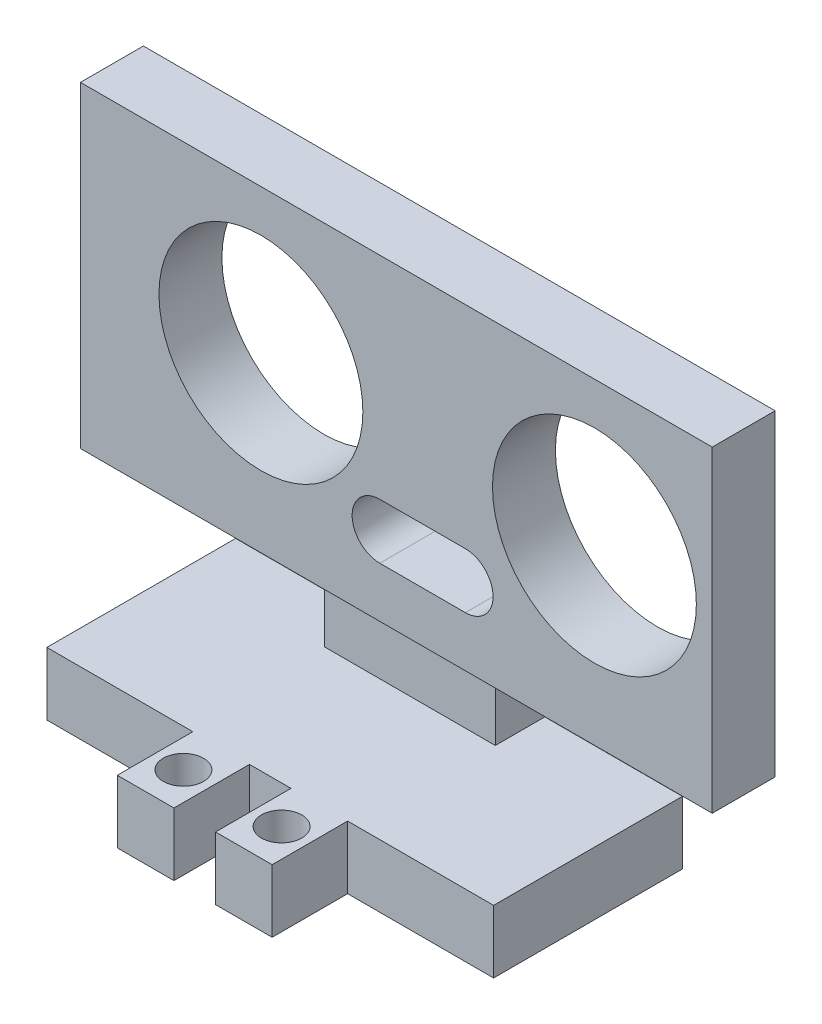
ISO-10303-21;
HEADER;
FILE_DESCRIPTION(('STEP AP214'),'2;1');
FILE_NAME('part.step','',(''),(''),'','','');
FILE_SCHEMA(('AUTOMOTIVE_DESIGN { 1 0 10303 214 1 1 1 1 }'));
ENDSEC;
DATA;
#1=APPLICATION_CONTEXT('core data for automotive mechanical design processes');
#2=APPLICATION_PROTOCOL_DEFINITION('international standard','automotive_design',2000,#1);
#3=PRODUCT_CONTEXT('',#1,'mechanical');
#4=PRODUCT('Part','Part','',(#3));
#5=PRODUCT_RELATED_PRODUCT_CATEGORY('part','',(#4));
#6=PRODUCT_DEFINITION_FORMATION('','',#4);
#7=PRODUCT_DEFINITION_CONTEXT('part definition',#1,'design');
#8=PRODUCT_DEFINITION('design','',#6,#7);
#9=PRODUCT_DEFINITION_SHAPE('','',#8);
#10=(LENGTH_UNIT() NAMED_UNIT(*) SI_UNIT(.MILLI.,.METRE.));
#11=(NAMED_UNIT(*) PLANE_ANGLE_UNIT() SI_UNIT($,.RADIAN.));
#12=(NAMED_UNIT(*) SI_UNIT($,.STERADIAN.) SOLID_ANGLE_UNIT());
#13=UNCERTAINTY_MEASURE_WITH_UNIT(LENGTH_MEASURE(1.E-05),#10,'distance_accuracy_value','');
#14=(GEOMETRIC_REPRESENTATION_CONTEXT(3) GLOBAL_UNCERTAINTY_ASSIGNED_CONTEXT((#13)) GLOBAL_UNIT_ASSIGNED_CONTEXT((#10,
#11,#12)) REPRESENTATION_CONTEXT('',''));
#15=CARTESIAN_POINT('',(0.,0.,0.));
#16=DIRECTION('',(0.,0.,1.));
#17=DIRECTION('',(1.,0.,0.));
#18=AXIS2_PLACEMENT_3D('',#15,#16,#17);
#19=CARTESIAN_POINT('',(0.,5.,-21.2753882568971));
#20=DIRECTION('',(0.,0.,-1.));
#21=DIRECTION('',(-1.,0.,0.));
#22=AXIS2_PLACEMENT_3D('',#19,#20,#21);
#23=PLANE('',#22);
#24=DIRECTION('',(1.,0.,0.));
#25=VECTOR('',#24,1.);
#26=CARTESIAN_POINT('',(0.,0.,-21.2753882568971));
#27=LINE('',#26,#25);
#28=CARTESIAN_POINT('',(12.7692142640546,0.,-21.2753882568971));
#29=VERTEX_POINT('',#28);
#30=CARTESIAN_POINT('',(48.2692142640546,0.,-21.2753882568971));
#31=VERTEX_POINT('',#30);
#32=EDGE_CURVE('E304',#29,#31,#27,.T.);
#33=ORIENTED_EDGE('',*,*,#32,.F.);
#34=DIRECTION('',(0.,-1.,0.));
#35=VECTOR('',#34,1.);
#36=CARTESIAN_POINT('',(12.7692142640546,5.,-21.2753882568971));
#37=LINE('',#36,#35);
#38=CARTESIAN_POINT('',(12.7692142640546,5.,-21.2753882568971));
#39=VERTEX_POINT('',#38);
#40=EDGE_CURVE('E391',#39,#29,#37,.T.);
#41=ORIENTED_EDGE('',*,*,#40,.F.);
#42=DIRECTION('',(1.,0.,0.));
#43=VECTOR('',#42,1.);
#44=CARTESIAN_POINT('',(0.,5.,-21.2753882568971));
#45=LINE('',#44,#43);
#46=CARTESIAN_POINT('',(23.7692142640546,5.,-21.2753882568971));
#47=VERTEX_POINT('',#46);
#48=EDGE_CURVE('E305',#39,#47,#45,.T.);
#49=ORIENTED_EDGE('',*,*,#48,.T.);
#50=DIRECTION('',(0.,-1.,0.));
#51=VECTOR('',#50,1.);
#52=CARTESIAN_POINT('',(23.7692142640546,10.,-21.2753882568971));
#53=LINE('',#52,#51);
#54=CARTESIAN_POINT('',(23.7692142640546,10.,-21.2753882568971));
#55=VERTEX_POINT('',#54);
#56=EDGE_CURVE('E285',#55,#47,#53,.T.);
#57=ORIENTED_EDGE('',*,*,#56,.F.);
#58=DIRECTION('',(-1.,0.,0.));
#59=VECTOR('',#58,1.);
#60=CARTESIAN_POINT('',(23.7692142640546,10.,-21.2753882568971));
#61=LINE('',#60,#59);
#62=CARTESIAN_POINT('',(37.3362993394962,10.,-21.2753882568971));
#63=VERTEX_POINT('',#62);
#64=EDGE_CURVE('E282',#63,#55,#61,.T.);
#65=ORIENTED_EDGE('',*,*,#64,.F.);
#66=DIRECTION('',(0.,-1.,0.));
#67=VECTOR('',#66,1.);
#68=CARTESIAN_POINT('',(37.3362993394962,10.,-21.2753882568971));
#69=LINE('',#68,#67);
#70=CARTESIAN_POINT('',(37.3362993394962,5.,-21.2753882568971));
#71=VERTEX_POINT('',#70);
#72=EDGE_CURVE('E295',#63,#71,#69,.T.);
#73=ORIENTED_EDGE('',*,*,#72,.T.);
#74=CARTESIAN_POINT('',(48.2692142640546,5.,-21.2753882568971));
#75=VERTEX_POINT('',#74);
#76=EDGE_CURVE('E309',#71,#75,#45,.T.);
#77=ORIENTED_EDGE('',*,*,#76,.T.);
#78=DIRECTION('',(0.,-1.,0.));
#79=VECTOR('',#78,1.);
#80=CARTESIAN_POINT('',(48.2692142640546,5.,-21.2753882568971));
#81=LINE('',#80,#79);
#82=EDGE_CURVE('E334',#75,#31,#81,.T.);
#83=ORIENTED_EDGE('',*,*,#82,.T.);
#84=EDGE_LOOP('',(#33,#41,#49,#57,#65,#73,#77,#83));
#85=FACE_BOUND('',#84,.T.);
#86=ADVANCED_FACE('F44',(#85),#23,.T.);
#87=CARTESIAN_POINT('',(12.7692142640546,5.,0.));
#88=DIRECTION('',(1.,0.,0.));
#89=DIRECTION('',(0.,0.,-1.));
#90=AXIS2_PLACEMENT_3D('',#87,#88,#89);
#91=PLANE('',#90);
#92=DIRECTION('',(0.,0.,1.));
#93=VECTOR('',#92,1.);
#94=CARTESIAN_POINT('',(12.7692142640546,0.,0.));
#95=LINE('',#94,#93);
#96=CARTESIAN_POINT('',(12.7692142640546,0.,-6.27538825689709));
#97=VERTEX_POINT('',#96);
#98=EDGE_CURVE('E337',#29,#97,#95,.T.);
#99=ORIENTED_EDGE('',*,*,#98,.T.);
#100=DIRECTION('',(0.,-1.,0.));
#101=VECTOR('',#100,1.);
#102=CARTESIAN_POINT('',(12.7692142640546,5.,-6.27538825689709));
#103=LINE('',#102,#101);
#104=CARTESIAN_POINT('',(12.7692142640546,5.,-6.27538825689709));
#105=VERTEX_POINT('',#104);
#106=EDGE_CURVE('E388',#105,#97,#103,.T.);
#107=ORIENTED_EDGE('',*,*,#106,.F.);
#108=DIRECTION('',(0.,0.,1.));
#109=VECTOR('',#108,1.);
#110=CARTESIAN_POINT('',(12.7692142640546,5.,0.));
#111=LINE('',#110,#109);
#112=EDGE_CURVE('E308',#39,#105,#111,.T.);
#113=ORIENTED_EDGE('',*,*,#112,.F.);
#114=ORIENTED_EDGE('',*,*,#40,.T.);
#115=EDGE_LOOP('',(#99,#107,#113,#114));
#116=FACE_BOUND('',#115,.T.);
#117=ADVANCED_FACE('F453',(#116),#91,.F.);
#118=CARTESIAN_POINT('',(0.,5.,-6.27538825689709));
#119=DIRECTION('',(0.,0.,-1.));
#120=DIRECTION('',(-1.,0.,0.));
#121=AXIS2_PLACEMENT_3D('',#118,#119,#120);
#122=PLANE('',#121);
#123=DIRECTION('',(1.,0.,0.));
#124=VECTOR('',#123,1.);
#125=CARTESIAN_POINT('',(0.,0.,-6.27538825689709));
#126=LINE('',#125,#124);
#127=CARTESIAN_POINT('',(24.3692142640547,0.,-6.27538825689709));
#128=VERTEX_POINT('',#127);
#129=EDGE_CURVE('E339',#97,#128,#126,.T.);
#130=ORIENTED_EDGE('',*,*,#129,.T.);
#131=DIRECTION('',(0.,-1.,0.));
#132=VECTOR('',#131,1.);
#133=CARTESIAN_POINT('',(24.3692142640547,5.,-6.27538825689709));
#134=LINE('',#133,#132);
#135=CARTESIAN_POINT('',(24.3692142640547,5.,-6.27538825689709));
#136=VERTEX_POINT('',#135);
#137=EDGE_CURVE('E386',#136,#128,#134,.T.);
#138=ORIENTED_EDGE('',*,*,#137,.F.);
#139=DIRECTION('',(1.,0.,0.));
#140=VECTOR('',#139,1.);
#141=CARTESIAN_POINT('',(0.,5.,-6.27538825689709));
#142=LINE('',#141,#140);
#143=EDGE_CURVE('E311',#105,#136,#142,.T.);
#144=ORIENTED_EDGE('',*,*,#143,.F.);
#145=ORIENTED_EDGE('',*,*,#106,.T.);
#146=EDGE_LOOP('',(#130,#138,#144,#145));
#147=FACE_BOUND('',#146,.T.);
#148=ADVANCED_FACE('F458',(#147),#122,.F.);
#149=CARTESIAN_POINT('',(24.3692142640547,5.,0.));
#150=DIRECTION('',(-1.,0.,0.));
#151=DIRECTION('',(0.,0.,1.));
#152=AXIS2_PLACEMENT_3D('',#149,#150,#151);
#153=PLANE('',#152);
#154=DIRECTION('',(0.,0.,-1.));
#155=VECTOR('',#154,1.);
#156=CARTESIAN_POINT('',(24.3692142640547,0.,0.));
#157=LINE('',#156,#155);
#158=CARTESIAN_POINT('',(24.3692142640547,0.,-0.275388256897094));
#159=VERTEX_POINT('',#158);
#160=EDGE_CURVE('E342',#159,#128,#157,.T.);
#161=ORIENTED_EDGE('',*,*,#160,.F.);
#162=DIRECTION('',(0.,-1.,0.));
#163=VECTOR('',#162,1.);
#164=CARTESIAN_POINT('',(24.3692142640547,5.,-0.275388256897094));
#165=LINE('',#164,#163);
#166=CARTESIAN_POINT('',(24.3692142640547,5.,-0.275388256897094));
#167=VERTEX_POINT('',#166);
#168=EDGE_CURVE('E384',#167,#159,#165,.T.);
#169=ORIENTED_EDGE('',*,*,#168,.F.);
#170=DIRECTION('',(0.,0.,-1.));
#171=VECTOR('',#170,1.);
#172=CARTESIAN_POINT('',(24.3692142640547,5.,0.));
#173=LINE('',#172,#171);
#174=EDGE_CURVE('E313',#167,#136,#173,.T.);
#175=ORIENTED_EDGE('',*,*,#174,.T.);
#176=ORIENTED_EDGE('',*,*,#137,.T.);
#177=EDGE_LOOP('',(#161,#169,#175,#176));
#178=FACE_BOUND('',#177,.T.);
#179=ADVANCED_FACE('F463',(#178),#153,.T.);
#180=CARTESIAN_POINT('',(0.,5.,-0.275388256897092));
#181=DIRECTION('',(0.,0.,-1.));
#182=DIRECTION('',(-1.,0.,0.));
#183=AXIS2_PLACEMENT_3D('',#180,#181,#182);
#184=PLANE('',#183);
#185=DIRECTION('',(1.,0.,0.));
#186=VECTOR('',#185,1.);
#187=CARTESIAN_POINT('',(0.,0.,-0.275388256897092));
#188=LINE('',#187,#186);
#189=CARTESIAN_POINT('',(28.8692142640547,0.,-0.275388256897094));
#190=VERTEX_POINT('',#189);
#191=EDGE_CURVE('E345',#159,#190,#188,.T.);
#192=ORIENTED_EDGE('',*,*,#191,.T.);
#193=DIRECTION('',(0.,-1.,0.));
#194=VECTOR('',#193,1.);
#195=CARTESIAN_POINT('',(28.8692142640547,5.,-0.275388256897094));
#196=LINE('',#195,#194);
#197=CARTESIAN_POINT('',(28.8692142640547,5.,-0.275388256897094));
#198=VERTEX_POINT('',#197);
#199=EDGE_CURVE('E381',#198,#190,#196,.T.);
#200=ORIENTED_EDGE('',*,*,#199,.F.);
#201=DIRECTION('',(1.,0.,0.));
#202=VECTOR('',#201,1.);
#203=CARTESIAN_POINT('',(0.,5.,-0.275388256897092));
#204=LINE('',#203,#202);
#205=EDGE_CURVE('E316',#167,#198,#204,.T.);
#206=ORIENTED_EDGE('',*,*,#205,.F.);
#207=ORIENTED_EDGE('',*,*,#168,.T.);
#208=EDGE_LOOP('',(#192,#200,#206,#207));
#209=FACE_BOUND('',#208,.T.);
#210=ADVANCED_FACE('F469',(#209),#184,.F.);
#211=CARTESIAN_POINT('',(28.8692142640547,5.,0.));
#212=DIRECTION('',(-1.,0.,0.));
#213=DIRECTION('',(0.,0.,1.));
#214=AXIS2_PLACEMENT_3D('',#211,#212,#213);
#215=PLANE('',#214);
#216=DIRECTION('',(0.,0.,-1.));
#217=VECTOR('',#216,1.);
#218=CARTESIAN_POINT('',(28.8692142640547,0.,0.));
#219=LINE('',#218,#217);
#220=CARTESIAN_POINT('',(28.8692142640547,0.,-6.27538825689709));
#221=VERTEX_POINT('',#220);
#222=EDGE_CURVE('E347',#190,#221,#219,.T.);
#223=ORIENTED_EDGE('',*,*,#222,.T.);
#224=DIRECTION('',(0.,-1.,0.));
#225=VECTOR('',#224,1.);
#226=CARTESIAN_POINT('',(28.8692142640547,5.,-6.27538825689709));
#227=LINE('',#226,#225);
#228=CARTESIAN_POINT('',(28.8692142640547,5.,-6.27538825689709));
#229=VERTEX_POINT('',#228);
#230=EDGE_CURVE('E378',#229,#221,#227,.T.);
#231=ORIENTED_EDGE('',*,*,#230,.F.);
#232=DIRECTION('',(0.,0.,-1.));
#233=VECTOR('',#232,1.);
#234=CARTESIAN_POINT('',(28.8692142640547,5.,0.));
#235=LINE('',#234,#233);
#236=EDGE_CURVE('E318',#198,#229,#235,.T.);
#237=ORIENTED_EDGE('',*,*,#236,.F.);
#238=ORIENTED_EDGE('',*,*,#199,.T.);
#239=EDGE_LOOP('',(#223,#231,#237,#238));
#240=FACE_BOUND('',#239,.T.);
#241=ADVANCED_FACE('F473',(#240),#215,.F.);
#242=CARTESIAN_POINT('',(0.,5.,-6.27538825689709));
#243=DIRECTION('',(0.,0.,-1.));
#244=DIRECTION('',(-1.,0.,0.));
#245=AXIS2_PLACEMENT_3D('',#242,#243,#244);
#246=PLANE('',#245);
#247=DIRECTION('',(1.,0.,0.));
#248=VECTOR('',#247,1.);
#249=CARTESIAN_POINT('',(0.,0.,-6.27538825689709));
#250=LINE('',#249,#248);
#251=CARTESIAN_POINT('',(32.1692142640546,0.,-6.27538825689709));
#252=VERTEX_POINT('',#251);
#253=EDGE_CURVE('E349',#221,#252,#250,.T.);
#254=ORIENTED_EDGE('',*,*,#253,.T.);
#255=DIRECTION('',(0.,-1.,0.));
#256=VECTOR('',#255,1.);
#257=CARTESIAN_POINT('',(32.1692142640546,5.,-6.27538825689709));
#258=LINE('',#257,#256);
#259=CARTESIAN_POINT('',(32.1692142640546,5.,-6.27538825689709));
#260=VERTEX_POINT('',#259);
#261=EDGE_CURVE('E376',#260,#252,#258,.T.);
#262=ORIENTED_EDGE('',*,*,#261,.F.);
#263=DIRECTION('',(1.,0.,0.));
#264=VECTOR('',#263,1.);
#265=CARTESIAN_POINT('',(0.,5.,-6.27538825689709));
#266=LINE('',#265,#264);
#267=EDGE_CURVE('E320',#229,#260,#266,.T.);
#268=ORIENTED_EDGE('',*,*,#267,.F.);
#269=ORIENTED_EDGE('',*,*,#230,.T.);
#270=EDGE_LOOP('',(#254,#262,#268,#269));
#271=FACE_BOUND('',#270,.T.);
#272=ADVANCED_FACE('F477',(#271),#246,.F.);
#273=CARTESIAN_POINT('',(32.1692142640546,5.,0.));
#274=DIRECTION('',(-1.,0.,0.));
#275=DIRECTION('',(0.,0.,1.));
#276=AXIS2_PLACEMENT_3D('',#273,#274,#275);
#277=PLANE('',#276);
#278=DIRECTION('',(0.,0.,-1.));
#279=VECTOR('',#278,1.);
#280=CARTESIAN_POINT('',(32.1692142640546,0.,0.));
#281=LINE('',#280,#279);
#282=CARTESIAN_POINT('',(32.1692142640546,0.,-0.275388256897094));
#283=VERTEX_POINT('',#282);
#284=EDGE_CURVE('E352',#283,#252,#281,.T.);
#285=ORIENTED_EDGE('',*,*,#284,.F.);
#286=DIRECTION('',(0.,-1.,0.));
#287=VECTOR('',#286,1.);
#288=CARTESIAN_POINT('',(32.1692142640546,5.,-0.275388256897094));
#289=LINE('',#288,#287);
#290=CARTESIAN_POINT('',(32.1692142640546,5.,-0.275388256897094));
#291=VERTEX_POINT('',#290);
#292=EDGE_CURVE('E374',#291,#283,#289,.T.);
#293=ORIENTED_EDGE('',*,*,#292,.F.);
#294=DIRECTION('',(0.,0.,-1.));
#295=VECTOR('',#294,1.);
#296=CARTESIAN_POINT('',(32.1692142640546,5.,0.));
#297=LINE('',#296,#295);
#298=EDGE_CURVE('E322',#291,#260,#297,.T.);
#299=ORIENTED_EDGE('',*,*,#298,.T.);
#300=ORIENTED_EDGE('',*,*,#261,.T.);
#301=EDGE_LOOP('',(#285,#293,#299,#300));
#302=FACE_BOUND('',#301,.T.);
#303=ADVANCED_FACE('F481',(#302),#277,.T.);
#304=CARTESIAN_POINT('',(0.,5.,-0.275388256897095));
#305=DIRECTION('',(0.,0.,-1.));
#306=DIRECTION('',(-1.,0.,0.));
#307=AXIS2_PLACEMENT_3D('',#304,#305,#306);
#308=PLANE('',#307);
#309=DIRECTION('',(1.,0.,0.));
#310=VECTOR('',#309,1.);
#311=CARTESIAN_POINT('',(0.,0.,-0.275388256897095));
#312=LINE('',#311,#310);
#313=CARTESIAN_POINT('',(36.6692142640546,0.,-0.275388256897094));
#314=VERTEX_POINT('',#313);
#315=EDGE_CURVE('E355',#283,#314,#312,.T.);
#316=ORIENTED_EDGE('',*,*,#315,.T.);
#317=DIRECTION('',(0.,-1.,0.));
#318=VECTOR('',#317,1.);
#319=CARTESIAN_POINT('',(36.6692142640546,5.,-0.275388256897094));
#320=LINE('',#319,#318);
#321=CARTESIAN_POINT('',(36.6692142640546,5.,-0.275388256897094));
#322=VERTEX_POINT('',#321);
#323=EDGE_CURVE('E371',#322,#314,#320,.T.);
#324=ORIENTED_EDGE('',*,*,#323,.F.);
#325=DIRECTION('',(1.,0.,0.));
#326=VECTOR('',#325,1.);
#327=CARTESIAN_POINT('',(0.,5.,-0.275388256897095));
#328=LINE('',#327,#326);
#329=EDGE_CURVE('E325',#291,#322,#328,.T.);
#330=ORIENTED_EDGE('',*,*,#329,.F.);
#331=ORIENTED_EDGE('',*,*,#292,.T.);
#332=EDGE_LOOP('',(#316,#324,#330,#331));
#333=FACE_BOUND('',#332,.T.);
#334=ADVANCED_FACE('F485',(#333),#308,.F.);
#335=CARTESIAN_POINT('',(36.6692142640546,5.,0.));
#336=DIRECTION('',(-1.,0.,0.));
#337=DIRECTION('',(0.,0.,1.));
#338=AXIS2_PLACEMENT_3D('',#335,#336,#337);
#339=PLANE('',#338);
#340=DIRECTION('',(0.,0.,-1.));
#341=VECTOR('',#340,1.);
#342=CARTESIAN_POINT('',(36.6692142640546,0.,0.));
#343=LINE('',#342,#341);
#344=CARTESIAN_POINT('',(36.6692142640546,0.,-6.27538825689709));
#345=VERTEX_POINT('',#344);
#346=EDGE_CURVE('E357',#314,#345,#343,.T.);
#347=ORIENTED_EDGE('',*,*,#346,.T.);
#348=DIRECTION('',(0.,-1.,0.));
#349=VECTOR('',#348,1.);
#350=CARTESIAN_POINT('',(36.6692142640546,5.,-6.27538825689709));
#351=LINE('',#350,#349);
#352=CARTESIAN_POINT('',(36.6692142640546,5.,-6.27538825689709));
#353=VERTEX_POINT('',#352);
#354=EDGE_CURVE('E368',#353,#345,#351,.T.);
#355=ORIENTED_EDGE('',*,*,#354,.F.);
#356=DIRECTION('',(0.,0.,-1.));
#357=VECTOR('',#356,1.);
#358=CARTESIAN_POINT('',(36.6692142640546,5.,0.));
#359=LINE('',#358,#357);
#360=EDGE_CURVE('E327',#322,#353,#359,.T.);
#361=ORIENTED_EDGE('',*,*,#360,.F.);
#362=ORIENTED_EDGE('',*,*,#323,.T.);
#363=EDGE_LOOP('',(#347,#355,#361,#362));
#364=FACE_BOUND('',#363,.T.);
#365=ADVANCED_FACE('F489',(#364),#339,.F.);
#366=CARTESIAN_POINT('',(0.,5.,-6.27538825689709));
#367=DIRECTION('',(0.,0.,-1.));
#368=DIRECTION('',(-1.,0.,0.));
#369=AXIS2_PLACEMENT_3D('',#366,#367,#368);
#370=PLANE('',#369);
#371=DIRECTION('',(1.,0.,0.));
#372=VECTOR('',#371,1.);
#373=CARTESIAN_POINT('',(0.,0.,-6.27538825689709));
#374=LINE('',#373,#372);
#375=CARTESIAN_POINT('',(48.2692142640546,0.,-6.27538825689709));
#376=VERTEX_POINT('',#375);
#377=EDGE_CURVE('E359',#345,#376,#374,.T.);
#378=ORIENTED_EDGE('',*,*,#377,.T.);
#379=DIRECTION('',(0.,-1.,0.));
#380=VECTOR('',#379,1.);
#381=CARTESIAN_POINT('',(48.2692142640546,5.,-6.27538825689709));
#382=LINE('',#381,#380);
#383=CARTESIAN_POINT('',(48.2692142640546,5.,-6.27538825689709));
#384=VERTEX_POINT('',#383);
#385=EDGE_CURVE('E366',#384,#376,#382,.T.);
#386=ORIENTED_EDGE('',*,*,#385,.F.);
#387=DIRECTION('',(1.,0.,0.));
#388=VECTOR('',#387,1.);
#389=CARTESIAN_POINT('',(0.,5.,-6.27538825689709));
#390=LINE('',#389,#388);
#391=EDGE_CURVE('E329',#353,#384,#390,.T.);
#392=ORIENTED_EDGE('',*,*,#391,.F.);
#393=ORIENTED_EDGE('',*,*,#354,.T.);
#394=EDGE_LOOP('',(#378,#386,#392,#393));
#395=FACE_BOUND('',#394,.T.);
#396=ADVANCED_FACE('F493',(#395),#370,.F.);
#397=CARTESIAN_POINT('',(48.2692142640546,5.,0.));
#398=DIRECTION('',(1.,0.,0.));
#399=DIRECTION('',(0.,0.,-1.));
#400=AXIS2_PLACEMENT_3D('',#397,#398,#399);
#401=PLANE('',#400);
#402=DIRECTION('',(0.,0.,1.));
#403=VECTOR('',#402,1.);
#404=CARTESIAN_POINT('',(48.2692142640546,0.,0.));
#405=LINE('',#404,#403);
#406=EDGE_CURVE('E362',#31,#376,#405,.T.);
#407=ORIENTED_EDGE('',*,*,#406,.F.);
#408=ORIENTED_EDGE('',*,*,#82,.F.);
#409=DIRECTION('',(0.,0.,1.));
#410=VECTOR('',#409,1.);
#411=CARTESIAN_POINT('',(48.2692142640546,5.,0.));
#412=LINE('',#411,#410);
#413=EDGE_CURVE('E331',#75,#384,#412,.T.);
#414=ORIENTED_EDGE('',*,*,#413,.T.);
#415=ORIENTED_EDGE('',*,*,#385,.T.);
#416=EDGE_LOOP('',(#407,#408,#414,#415));
#417=FACE_BOUND('',#416,.T.);
#418=ADVANCED_FACE('F422',(#417),#401,.T.);
#419=CARTESIAN_POINT('',(0.,5.,0.));
#420=DIRECTION('',(0.,1.,0.));
#421=DIRECTION('',(0.,0.,1.));
#422=AXIS2_PLACEMENT_3D('',#419,#420,#421);
#423=PLANE('',#422);
#424=CARTESIAN_POINT('',(26.6192142640546,5.,-3.27538825689709));
#425=DIRECTION('',(0.,1.,0.));
#426=DIRECTION('',(0.,0.,1.));
#427=AXIS2_PLACEMENT_3D('',#424,#425,#426);
#428=CIRCLE('',#427,1.6);
#429=CARTESIAN_POINT('',(26.6192142640546,5.,-1.67538825689709));
#430=VERTEX_POINT('',#429);
#431=EDGE_CURVE('E402',#430,#430,#428,.T.);
#432=ORIENTED_EDGE('',*,*,#431,.F.);
#433=EDGE_LOOP('',(#432));
#434=FACE_BOUND('',#433,.T.);
#435=CARTESIAN_POINT('',(34.4192142640546,5.,-3.27538825689709));
#436=DIRECTION('',(0.,1.,0.));
#437=DIRECTION('',(0.,0.,1.));
#438=AXIS2_PLACEMENT_3D('',#435,#436,#437);
#439=CIRCLE('',#438,1.6);
#440=CARTESIAN_POINT('',(34.4192142640546,5.,-1.6753882568971));
#441=VERTEX_POINT('',#440);
#442=EDGE_CURVE('E407',#441,#441,#439,.T.);
#443=ORIENTED_EDGE('',*,*,#442,.F.);
#444=EDGE_LOOP('',(#443));
#445=FACE_BOUND('',#444,.T.);
#446=DIRECTION('',(0.,0.,1.));
#447=VECTOR('',#446,1.);
#448=CARTESIAN_POINT('',(23.7692142640546,5.,-21.2753882568971));
#449=LINE('',#448,#447);
#450=CARTESIAN_POINT('',(23.7692142640546,5.,-17.3425959706985));
#451=VERTEX_POINT('',#450);
#452=EDGE_CURVE('E271',#47,#451,#449,.T.);
#453=ORIENTED_EDGE('',*,*,#452,.F.);
#454=ORIENTED_EDGE('',*,*,#48,.F.);
#455=ORIENTED_EDGE('',*,*,#112,.T.);
#456=ORIENTED_EDGE('',*,*,#143,.T.);
#457=ORIENTED_EDGE('',*,*,#174,.F.);
#458=ORIENTED_EDGE('',*,*,#205,.T.);
#459=ORIENTED_EDGE('',*,*,#236,.T.);
#460=ORIENTED_EDGE('',*,*,#267,.T.);
#461=ORIENTED_EDGE('',*,*,#298,.F.);
#462=ORIENTED_EDGE('',*,*,#329,.T.);
#463=ORIENTED_EDGE('',*,*,#360,.T.);
#464=ORIENTED_EDGE('',*,*,#391,.T.);
#465=ORIENTED_EDGE('',*,*,#413,.F.);
#466=ORIENTED_EDGE('',*,*,#76,.F.);
#467=DIRECTION('',(0.,0.,-1.));
#468=VECTOR('',#467,1.);
#469=CARTESIAN_POINT('',(37.3362993394962,5.,-21.2753882568971));
#470=LINE('',#469,#468);
#471=CARTESIAN_POINT('',(37.3362993394962,5.,-17.3425959706985));
#472=VERTEX_POINT('',#471);
#473=EDGE_CURVE('E276',#472,#71,#470,.T.);
#474=ORIENTED_EDGE('',*,*,#473,.F.);
#475=DIRECTION('',(1.,0.,0.));
#476=VECTOR('',#475,1.);
#477=CARTESIAN_POINT('',(23.7692142640546,5.,-17.3425959706985));
#478=LINE('',#477,#476);
#479=EDGE_CURVE('E288',#451,#472,#478,.T.);
#480=ORIENTED_EDGE('',*,*,#479,.F.);
#481=EDGE_LOOP('',(#453,#454,#455,#456,#457,#458,#459,#460,#461,#462,#463,#464,#465,#466,#474,#480));
#482=FACE_BOUND('',#481,.T.);
#483=ADVANCED_FACE('F418',(#434,#445,#482),#423,.T.);
#484=CARTESIAN_POINT('',(0.,0.,0.));
#485=DIRECTION('',(0.,1.,0.));
#486=DIRECTION('',(0.,0.,1.));
#487=AXIS2_PLACEMENT_3D('',#484,#485,#486);
#488=PLANE('',#487);
#489=CARTESIAN_POINT('',(26.6192142640546,0.,-3.27538825689709));
#490=DIRECTION('',(0.,1.,0.));
#491=DIRECTION('',(0.,0.,1.));
#492=AXIS2_PLACEMENT_3D('',#489,#490,#491);
#493=CIRCLE('',#492,1.6);
#494=CARTESIAN_POINT('',(26.6192142640546,0.,-1.67538825689709));
#495=VERTEX_POINT('',#494);
#496=EDGE_CURVE('E47',#495,#495,#493,.T.);
#497=ORIENTED_EDGE('',*,*,#496,.T.);
#498=EDGE_LOOP('',(#497));
#499=FACE_BOUND('',#498,.T.);
#500=CARTESIAN_POINT('',(34.4192142640546,0.,-3.27538825689709));
#501=DIRECTION('',(0.,1.,0.));
#502=DIRECTION('',(0.,0.,1.));
#503=AXIS2_PLACEMENT_3D('',#500,#501,#502);
#504=CIRCLE('',#503,1.6);
#505=CARTESIAN_POINT('',(34.4192142640546,0.,-1.6753882568971));
#506=VERTEX_POINT('',#505);
#507=EDGE_CURVE('E400',#506,#506,#504,.T.);
#508=ORIENTED_EDGE('',*,*,#507,.T.);
#509=EDGE_LOOP('',(#508));
#510=FACE_BOUND('',#509,.T.);
#511=ORIENTED_EDGE('',*,*,#32,.T.);
#512=ORIENTED_EDGE('',*,*,#406,.T.);
#513=ORIENTED_EDGE('',*,*,#377,.F.);
#514=ORIENTED_EDGE('',*,*,#346,.F.);
#515=ORIENTED_EDGE('',*,*,#315,.F.);
#516=ORIENTED_EDGE('',*,*,#284,.T.);
#517=ORIENTED_EDGE('',*,*,#253,.F.);
#518=ORIENTED_EDGE('',*,*,#222,.F.);
#519=ORIENTED_EDGE('',*,*,#191,.F.);
#520=ORIENTED_EDGE('',*,*,#160,.T.);
#521=ORIENTED_EDGE('',*,*,#129,.F.);
#522=ORIENTED_EDGE('',*,*,#98,.F.);
#523=EDGE_LOOP('',(#511,#512,#513,#514,#515,#516,#517,#518,#519,#520,#521,#522));
#524=FACE_BOUND('',#523,.T.);
#525=ADVANCED_FACE('F421',(#499,#510,#524),#488,.F.);
#526=CARTESIAN_POINT('',(23.7692142640546,10.,-21.2753882568971));
#527=DIRECTION('',(1.,0.,0.));
#528=DIRECTION('',(0.,0.,-1.));
#529=AXIS2_PLACEMENT_3D('',#526,#527,#528);
#530=PLANE('',#529);
#531=ORIENTED_EDGE('',*,*,#452,.T.);
#532=DIRECTION('',(0.,-1.,0.));
#533=VECTOR('',#532,1.);
#534=CARTESIAN_POINT('',(23.7692142640546,10.,-17.3425959706985));
#535=LINE('',#534,#533);
#536=CARTESIAN_POINT('',(23.7692142640546,10.,-17.3425959706985));
#537=VERTEX_POINT('',#536);
#538=EDGE_CURVE('E301',#537,#451,#535,.T.);
#539=ORIENTED_EDGE('',*,*,#538,.F.);
#540=DIRECTION('',(0.,0.,1.));
#541=VECTOR('',#540,1.);
#542=CARTESIAN_POINT('',(23.7692142640546,10.,-21.2753882568971));
#543=LINE('',#542,#541);
#544=EDGE_CURVE('E272',#55,#537,#543,.T.);
#545=ORIENTED_EDGE('',*,*,#544,.F.);
#546=ORIENTED_EDGE('',*,*,#56,.T.);
#547=EDGE_LOOP('',(#531,#539,#545,#546));
#548=FACE_BOUND('',#547,.T.);
#549=ADVANCED_FACE('F433',(#548),#530,.F.);
#550=CARTESIAN_POINT('',(23.7692142640546,10.,-17.3425959706985));
#551=DIRECTION('',(0.,0.,-1.));
#552=DIRECTION('',(-1.,0.,0.));
#553=AXIS2_PLACEMENT_3D('',#550,#551,#552);
#554=PLANE('',#553);
#555=ORIENTED_EDGE('',*,*,#479,.T.);
#556=DIRECTION('',(0.,-1.,0.));
#557=VECTOR('',#556,1.);
#558=CARTESIAN_POINT('',(37.3362993394962,10.,-17.3425959706985));
#559=LINE('',#558,#557);
#560=CARTESIAN_POINT('',(37.3362993394962,10.,-17.3425959706985));
#561=VERTEX_POINT('',#560);
#562=EDGE_CURVE('E298',#561,#472,#559,.T.);
#563=ORIENTED_EDGE('',*,*,#562,.F.);
#564=DIRECTION('',(1.,0.,0.));
#565=VECTOR('',#564,1.);
#566=CARTESIAN_POINT('',(23.7692142640546,10.,-17.3425959706985));
#567=LINE('',#566,#565);
#568=EDGE_CURVE('E275',#537,#561,#567,.T.);
#569=ORIENTED_EDGE('',*,*,#568,.F.);
#570=ORIENTED_EDGE('',*,*,#538,.T.);
#571=EDGE_LOOP('',(#555,#563,#569,#570));
#572=FACE_BOUND('',#571,.T.);
#573=ADVANCED_FACE('F443',(#572),#554,.F.);
#574=CARTESIAN_POINT('',(37.3362993394962,10.,-21.2753882568971));
#575=DIRECTION('',(-1.,0.,0.));
#576=DIRECTION('',(0.,0.,1.));
#577=AXIS2_PLACEMENT_3D('',#574,#575,#576);
#578=PLANE('',#577);
#579=ORIENTED_EDGE('',*,*,#473,.T.);
#580=ORIENTED_EDGE('',*,*,#72,.F.);
#581=DIRECTION('',(0.,0.,-1.));
#582=VECTOR('',#581,1.);
#583=CARTESIAN_POINT('',(37.3362993394962,10.,-21.2753882568971));
#584=LINE('',#583,#582);
#585=EDGE_CURVE('E279',#561,#63,#584,.T.);
#586=ORIENTED_EDGE('',*,*,#585,.F.);
#587=ORIENTED_EDGE('',*,*,#562,.T.);
#588=EDGE_LOOP('',(#579,#580,#586,#587));
#589=FACE_BOUND('',#588,.T.);
#590=ADVANCED_FACE('F440',(#589),#578,.F.);
#591=CARTESIAN_POINT('',(5.41921426405465,35.2,-16.2947715854473));
#592=DIRECTION('',(0.,0.,-1.));
#593=DIRECTION('',(-1.,0.,0.));
#594=AXIS2_PLACEMENT_3D('',#591,#592,#593);
#595=PLANE('',#594);
#596=CARTESIAN_POINT('',(36.0061070405581,16.2,-16.2947715854473));
#597=DIRECTION('',(0.,0.,1.));
#598=DIRECTION('',(1.,0.,0.));
#599=AXIS2_PLACEMENT_3D('',#596,#597,#598);
#600=CIRCLE('',#599,2.2);
#601=CARTESIAN_POINT('',(36.0061070405581,14.,-16.2947715854473));
#602=VERTEX_POINT('',#601);
#603=CARTESIAN_POINT('',(36.0061070405581,18.4,-16.2947715854473));
#604=VERTEX_POINT('',#603);
#605=EDGE_CURVE('E217',#602,#604,#600,.T.);
#606=ORIENTED_EDGE('',*,*,#605,.F.);
#607=DIRECTION('',(1.,0.,0.));
#608=VECTOR('',#607,1.);
#609=CARTESIAN_POINT('',(0.,14.,-16.2947715854473));
#610=LINE('',#609,#608);
#611=CARTESIAN_POINT('',(29.2061070405581,14.,-16.2947715854473));
#612=VERTEX_POINT('',#611);
#613=EDGE_CURVE('E60',#612,#602,#610,.T.);
#614=ORIENTED_EDGE('',*,*,#613,.F.);
#615=CARTESIAN_POINT('',(29.2061070405581,16.2,-16.2947715854473));
#616=DIRECTION('',(0.,0.,1.));
#617=DIRECTION('',(1.,0.,0.));
#618=AXIS2_PLACEMENT_3D('',#615,#616,#617);
#619=CIRCLE('',#618,2.2);
#620=CARTESIAN_POINT('',(29.2061070405581,18.4,-16.2947715854473));
#621=VERTEX_POINT('',#620);
#622=EDGE_CURVE('E224',#621,#612,#619,.T.);
#623=ORIENTED_EDGE('',*,*,#622,.F.);
#624=DIRECTION('',(1.,0.,0.));
#625=VECTOR('',#624,1.);
#626=CARTESIAN_POINT('',(0.,18.4,-16.2947715854473));
#627=LINE('',#626,#625);
#628=EDGE_CURVE('E208',#621,#604,#627,.T.);
#629=ORIENTED_EDGE('',*,*,#628,.T.);
#630=EDGE_LOOP('',(#606,#614,#623,#629));
#631=FACE_BOUND('',#630,.T.);
#632=CARTESIAN_POINT('',(19.7589001193031,23.75,-16.2947715854473));
#633=DIRECTION('',(0.,0.,1.));
#634=DIRECTION('',(1.,0.,0.));
#635=AXIS2_PLACEMENT_3D('',#632,#633,#634);
#636=CIRCLE('',#635,8.09999999999999);
#637=CARTESIAN_POINT('',(27.8589001193031,23.75,-16.2947715854473));
#638=VERTEX_POINT('',#637);
#639=EDGE_CURVE('E234',#638,#638,#636,.T.);
#640=ORIENTED_EDGE('',*,*,#639,.F.);
#641=EDGE_LOOP('',(#640));
#642=FACE_BOUND('',#641,.T.);
#643=CARTESIAN_POINT('',(46.2589001193031,23.75,-16.2947715854473));
#644=DIRECTION('',(0.,0.,1.));
#645=DIRECTION('',(1.,0.,0.));
#646=AXIS2_PLACEMENT_3D('',#643,#644,#645);
#647=CIRCLE('',#646,8.1);
#648=CARTESIAN_POINT('',(54.3589001193031,23.75,-16.2947715854473));
#649=VERTEX_POINT('',#648);
#650=EDGE_CURVE('E231',#649,#649,#647,.T.);
#651=ORIENTED_EDGE('',*,*,#650,.F.);
#652=EDGE_LOOP('',(#651));
#653=FACE_BOUND('',#652,.T.);
#654=DIRECTION('',(1.,0.,0.));
#655=VECTOR('',#654,1.);
#656=CARTESIAN_POINT('',(5.41921426405465,10.,-16.2947715854473));
#657=LINE('',#656,#655);
#658=CARTESIAN_POINT('',(5.41921426405465,10.,-16.2947715854473));
#659=VERTEX_POINT('',#658);
#660=CARTESIAN_POINT('',(55.6192142640547,10.,-16.2947715854473));
#661=VERTEX_POINT('',#660);
#662=EDGE_CURVE('E252',#659,#661,#657,.T.);
#663=ORIENTED_EDGE('',*,*,#662,.T.);
#664=DIRECTION('',(0.,-1.,0.));
#665=VECTOR('',#664,1.);
#666=CARTESIAN_POINT('',(55.6192142640547,35.2,-16.2947715854473));
#667=LINE('',#666,#665);
#668=CARTESIAN_POINT('',(55.6192142640547,35.2,-16.2947715854473));
#669=VERTEX_POINT('',#668);
#670=EDGE_CURVE('E269',#669,#661,#667,.T.);
#671=ORIENTED_EDGE('',*,*,#670,.F.);
#672=DIRECTION('',(1.,0.,0.));
#673=VECTOR('',#672,1.);
#674=CARTESIAN_POINT('',(5.41921426405465,35.2,-16.2947715854473));
#675=LINE('',#674,#673);
#676=CARTESIAN_POINT('',(5.41921426405465,35.2,-16.2947715854473));
#677=VERTEX_POINT('',#676);
#678=EDGE_CURVE('E240',#677,#669,#675,.T.);
#679=ORIENTED_EDGE('',*,*,#678,.F.);
#680=DIRECTION('',(0.,-1.,0.));
#681=VECTOR('',#680,1.);
#682=CARTESIAN_POINT('',(5.41921426405465,35.2,-16.2947715854473));
#683=LINE('',#682,#681);
#684=EDGE_CURVE('E251',#677,#659,#683,.T.);
#685=ORIENTED_EDGE('',*,*,#684,.T.);
#686=EDGE_LOOP('',(#663,#671,#679,#685));
#687=FACE_BOUND('',#686,.T.);
#688=ADVANCED_FACE('F221',(#631,#642,#653,#687),#595,.F.);
#689=CARTESIAN_POINT('',(55.6192142640547,35.2,-21.2947715854473));
#690=DIRECTION('',(1.,0.,0.));
#691=DIRECTION('',(0.,0.,-1.));
#692=AXIS2_PLACEMENT_3D('',#689,#690,#691);
#693=PLANE('',#692);
#694=DIRECTION('',(0.,0.,1.));
#695=VECTOR('',#694,1.);
#696=CARTESIAN_POINT('',(55.6192142640547,10.,-21.2947715854473));
#697=LINE('',#696,#695);
#698=CARTESIAN_POINT('',(55.6192142640547,10.,-21.2947715854473));
#699=VERTEX_POINT('',#698);
#700=EDGE_CURVE('E255',#699,#661,#697,.T.);
#701=ORIENTED_EDGE('',*,*,#700,.F.);
#702=DIRECTION('',(0.,-1.,0.));
#703=VECTOR('',#702,1.);
#704=CARTESIAN_POINT('',(55.6192142640547,35.2,-21.2947715854473));
#705=LINE('',#704,#703);
#706=CARTESIAN_POINT('',(55.6192142640547,35.2,-21.2947715854473));
#707=VERTEX_POINT('',#706);
#708=EDGE_CURVE('E267',#707,#699,#705,.T.);
#709=ORIENTED_EDGE('',*,*,#708,.F.);
#710=DIRECTION('',(0.,0.,1.));
#711=VECTOR('',#710,1.);
#712=CARTESIAN_POINT('',(55.6192142640547,35.2,-21.2947715854473));
#713=LINE('',#712,#711);
#714=EDGE_CURVE('E242',#707,#669,#713,.T.);
#715=ORIENTED_EDGE('',*,*,#714,.T.);
#716=ORIENTED_EDGE('',*,*,#670,.T.);
#717=EDGE_LOOP('',(#701,#709,#715,#716));
#718=FACE_BOUND('',#717,.T.);
#719=ADVANCED_FACE('F575',(#718),#693,.T.);
#720=CARTESIAN_POINT('',(5.41921426405465,35.2,-21.2947715854473));
#721=DIRECTION('',(0.,0.,-1.));
#722=DIRECTION('',(-1.,0.,0.));
#723=AXIS2_PLACEMENT_3D('',#720,#721,#722);
#724=PLANE('',#723);
#725=DIRECTION('',(-1.,0.,0.));
#726=VECTOR('',#725,1.);
#727=CARTESIAN_POINT('',(5.41921426405465,14.,-21.2947715854473));
#728=LINE('',#727,#726);
#729=CARTESIAN_POINT('',(36.0061070405581,14.,-21.2947715854473));
#730=VERTEX_POINT('',#729);
#731=CARTESIAN_POINT('',(29.2061070405581,14.,-21.2947715854473));
#732=VERTEX_POINT('',#731);
#733=EDGE_CURVE('E11',#730,#732,#728,.T.);
#734=ORIENTED_EDGE('',*,*,#733,.F.);
#735=CARTESIAN_POINT('',(36.0061070405581,16.2,-21.2947715854473));
#736=DIRECTION('',(0.,0.,-1.));
#737=DIRECTION('',(-1.,0.,0.));
#738=AXIS2_PLACEMENT_3D('',#735,#736,#737);
#739=CIRCLE('',#738,2.2);
#740=CARTESIAN_POINT('',(36.0061070405581,18.4,-21.2947715854473));
#741=VERTEX_POINT('',#740);
#742=EDGE_CURVE('E393',#741,#730,#739,.T.);
#743=ORIENTED_EDGE('',*,*,#742,.F.);
#744=DIRECTION('',(-1.,0.,0.));
#745=VECTOR('',#744,1.);
#746=CARTESIAN_POINT('',(5.41921426405465,18.4,-21.2947715854473));
#747=LINE('',#746,#745);
#748=CARTESIAN_POINT('',(29.2061070405581,18.4,-21.2947715854473));
#749=VERTEX_POINT('',#748);
#750=EDGE_CURVE('E211',#741,#749,#747,.T.);
#751=ORIENTED_EDGE('',*,*,#750,.T.);
#752=CARTESIAN_POINT('',(29.2061070405581,16.2,-21.2947715854473));
#753=DIRECTION('',(0.,0.,-1.));
#754=DIRECTION('',(-1.,0.,0.));
#755=AXIS2_PLACEMENT_3D('',#752,#753,#754);
#756=CIRCLE('',#755,2.2);
#757=EDGE_CURVE('E52',#732,#749,#756,.T.);
#758=ORIENTED_EDGE('',*,*,#757,.F.);
#759=EDGE_LOOP('',(#734,#743,#751,#758));
#760=FACE_BOUND('',#759,.T.);
#761=CARTESIAN_POINT('',(19.7589001193031,23.75,-21.2947715854473));
#762=DIRECTION('',(0.,0.,-1.));
#763=DIRECTION('',(-1.,0.,0.));
#764=AXIS2_PLACEMENT_3D('',#761,#762,#763);
#765=CIRCLE('',#764,8.09999999999999);
#766=CARTESIAN_POINT('',(11.6589001193031,23.75,-21.2947715854473));
#767=VERTEX_POINT('',#766);
#768=EDGE_CURVE('E256',#767,#767,#765,.T.);
#769=ORIENTED_EDGE('',*,*,#768,.F.);
#770=EDGE_LOOP('',(#769));
#771=FACE_BOUND('',#770,.T.);
#772=CARTESIAN_POINT('',(46.2589001193031,23.75,-21.2947715854473));
#773=DIRECTION('',(0.,0.,-1.));
#774=DIRECTION('',(-1.,0.,0.));
#775=AXIS2_PLACEMENT_3D('',#772,#773,#774);
#776=CIRCLE('',#775,8.1);
#777=CARTESIAN_POINT('',(38.1589001193031,23.75,-21.2947715854473));
#778=VERTEX_POINT('',#777);
#779=EDGE_CURVE('E237',#778,#778,#776,.T.);
#780=ORIENTED_EDGE('',*,*,#779,.F.);
#781=EDGE_LOOP('',(#780));
#782=FACE_BOUND('',#781,.T.);
#783=DIRECTION('',(1.,0.,0.));
#784=VECTOR('',#783,1.);
#785=CARTESIAN_POINT('',(5.41921426405465,10.,-21.2947715854473));
#786=LINE('',#785,#784);
#787=CARTESIAN_POINT('',(5.41921426405465,10.,-21.2947715854473));
#788=VERTEX_POINT('',#787);
#789=EDGE_CURVE('E259',#788,#699,#786,.T.);
#790=ORIENTED_EDGE('',*,*,#789,.F.);
#791=DIRECTION('',(0.,-1.,0.));
#792=VECTOR('',#791,1.);
#793=CARTESIAN_POINT('',(5.41921426405465,35.2,-21.2947715854473));
#794=LINE('',#793,#792);
#795=CARTESIAN_POINT('',(5.41921426405465,35.2,-21.2947715854473));
#796=VERTEX_POINT('',#795);
#797=EDGE_CURVE('E265',#796,#788,#794,.T.);
#798=ORIENTED_EDGE('',*,*,#797,.F.);
#799=DIRECTION('',(1.,0.,0.));
#800=VECTOR('',#799,1.);
#801=CARTESIAN_POINT('',(5.41921426405465,35.2,-21.2947715854473));
#802=LINE('',#801,#800);
#803=EDGE_CURVE('E246',#796,#707,#802,.T.);
#804=ORIENTED_EDGE('',*,*,#803,.T.);
#805=ORIENTED_EDGE('',*,*,#708,.T.);
#806=EDGE_LOOP('',(#790,#798,#804,#805));
#807=FACE_BOUND('',#806,.T.);
#808=ADVANCED_FACE('F571',(#760,#771,#782,#807),#724,.T.);
#809=CARTESIAN_POINT('',(5.41921426405465,35.2,-21.2947715854473));
#810=DIRECTION('',(1.,0.,0.));
#811=DIRECTION('',(0.,0.,-1.));
#812=AXIS2_PLACEMENT_3D('',#809,#810,#811);
#813=PLANE('',#812);
#814=DIRECTION('',(0.,0.,1.));
#815=VECTOR('',#814,1.);
#816=CARTESIAN_POINT('',(5.41921426405465,10.,-21.2947715854473));
#817=LINE('',#816,#815);
#818=EDGE_CURVE('E243',#788,#659,#817,.T.);
#819=ORIENTED_EDGE('',*,*,#818,.T.);
#820=ORIENTED_EDGE('',*,*,#684,.F.);
#821=DIRECTION('',(0.,0.,1.));
#822=VECTOR('',#821,1.);
#823=CARTESIAN_POINT('',(5.41921426405465,35.2,-21.2947715854473));
#824=LINE('',#823,#822);
#825=EDGE_CURVE('E249',#796,#677,#824,.T.);
#826=ORIENTED_EDGE('',*,*,#825,.F.);
#827=ORIENTED_EDGE('',*,*,#797,.T.);
#828=EDGE_LOOP('',(#819,#820,#826,#827));
#829=FACE_BOUND('',#828,.T.);
#830=ADVANCED_FACE('F565',(#829),#813,.F.);
#831=CARTESIAN_POINT('',(0.,35.2,0.));
#832=DIRECTION('',(0.,-1.,0.));
#833=DIRECTION('',(0.,0.,-1.));
#834=AXIS2_PLACEMENT_3D('',#831,#832,#833);
#835=PLANE('',#834);
#836=ORIENTED_EDGE('',*,*,#678,.T.);
#837=ORIENTED_EDGE('',*,*,#714,.F.);
#838=ORIENTED_EDGE('',*,*,#803,.F.);
#839=ORIENTED_EDGE('',*,*,#825,.T.);
#840=EDGE_LOOP('',(#836,#837,#838,#839));
#841=FACE_BOUND('',#840,.T.);
#842=ADVANCED_FACE('F562',(#841),#835,.F.);
#843=CARTESIAN_POINT('',(0.,10.,0.));
#844=DIRECTION('',(0.,-1.,0.));
#845=DIRECTION('',(0.,0.,-1.));
#846=AXIS2_PLACEMENT_3D('',#843,#844,#845);
#847=PLANE('',#846);
#848=ORIENTED_EDGE('',*,*,#64,.T.);
#849=ORIENTED_EDGE('',*,*,#544,.T.);
#850=ORIENTED_EDGE('',*,*,#568,.T.);
#851=ORIENTED_EDGE('',*,*,#585,.T.);
#852=EDGE_LOOP('',(#848,#849,#850,#851));
#853=FACE_BOUND('',#852,.T.);
#854=ORIENTED_EDGE('',*,*,#662,.F.);
#855=ORIENTED_EDGE('',*,*,#818,.F.);
#856=ORIENTED_EDGE('',*,*,#789,.T.);
#857=ORIENTED_EDGE('',*,*,#700,.T.);
#858=EDGE_LOOP('',(#854,#855,#856,#857));
#859=FACE_BOUND('',#858,.T.);
#860=ADVANCED_FACE('F435',(#853,#859),#847,.T.);
#861=CARTESIAN_POINT('',(46.2589001193031,23.75,-26.2947715854473));
#862=DIRECTION('',(0.,0.,1.));
#863=DIRECTION('',(1.,0.,0.));
#864=AXIS2_PLACEMENT_3D('',#861,#862,#863);
#865=CYLINDRICAL_SURFACE('',#864,8.1);
#866=ORIENTED_EDGE('',*,*,#779,.T.);
#867=EDGE_LOOP('',(#866));
#868=FACE_BOUND('',#867,.T.);
#869=ORIENTED_EDGE('',*,*,#650,.T.);
#870=EDGE_LOOP('',(#869));
#871=FACE_BOUND('',#870,.T.);
#872=ADVANCED_FACE('F557',(#868,#871),#865,.F.);
#873=CARTESIAN_POINT('',(19.7589001193031,23.75,-26.2947715854473));
#874=DIRECTION('',(0.,0.,1.));
#875=DIRECTION('',(1.,0.,0.));
#876=AXIS2_PLACEMENT_3D('',#873,#874,#875);
#877=CYLINDRICAL_SURFACE('',#876,8.09999999999999);
#878=ORIENTED_EDGE('',*,*,#768,.T.);
#879=EDGE_LOOP('',(#878));
#880=FACE_BOUND('',#879,.T.);
#881=ORIENTED_EDGE('',*,*,#639,.T.);
#882=EDGE_LOOP('',(#881));
#883=FACE_BOUND('',#882,.T.);
#884=ADVANCED_FACE('F554',(#880,#883),#877,.F.);
#885=CARTESIAN_POINT('',(0.,14.,-26.2947715854473));
#886=DIRECTION('',(0.,-1.,0.));
#887=DIRECTION('',(0.,0.,-1.));
#888=AXIS2_PLACEMENT_3D('',#885,#886,#887);
#889=PLANE('',#888);
#890=ORIENTED_EDGE('',*,*,#733,.T.);
#891=DIRECTION('',(0.,0.,1.));
#892=VECTOR('',#891,1.);
#893=CARTESIAN_POINT('',(29.2061070405581,14.,-26.2947715854473));
#894=LINE('',#893,#892);
#895=EDGE_CURVE('E229',#732,#612,#894,.T.);
#896=ORIENTED_EDGE('',*,*,#895,.T.);
#897=ORIENTED_EDGE('',*,*,#613,.T.);
#898=DIRECTION('',(0.,0.,1.));
#899=VECTOR('',#898,1.);
#900=CARTESIAN_POINT('',(36.0061070405581,14.,-26.2947715854473));
#901=LINE('',#900,#899);
#902=EDGE_CURVE('E214',#730,#602,#901,.T.);
#903=ORIENTED_EDGE('',*,*,#902,.F.);
#904=EDGE_LOOP('',(#890,#896,#897,#903));
#905=FACE_BOUND('',#904,.T.);
#906=ADVANCED_FACE('F546',(#905),#889,.F.);
#907=CARTESIAN_POINT('',(29.2061070405581,16.2,-26.2947715854473));
#908=DIRECTION('',(0.,0.,1.));
#909=DIRECTION('',(1.,0.,0.));
#910=AXIS2_PLACEMENT_3D('',#907,#908,#909);
#911=CYLINDRICAL_SURFACE('',#910,2.2);
#912=ORIENTED_EDGE('',*,*,#757,.T.);
#913=DIRECTION('',(0.,0.,1.));
#914=VECTOR('',#913,1.);
#915=CARTESIAN_POINT('',(29.2061070405581,18.4,-26.2947715854473));
#916=LINE('',#915,#914);
#917=EDGE_CURVE('E213',#749,#621,#916,.T.);
#918=ORIENTED_EDGE('',*,*,#917,.T.);
#919=ORIENTED_EDGE('',*,*,#622,.T.);
#920=ORIENTED_EDGE('',*,*,#895,.F.);
#921=EDGE_LOOP('',(#912,#918,#919,#920));
#922=FACE_BOUND('',#921,.T.);
#923=ADVANCED_FACE('F543',(#922),#911,.F.);
#924=CARTESIAN_POINT('',(0.,18.4,-26.2947715854473));
#925=DIRECTION('',(0.,-1.,0.));
#926=DIRECTION('',(0.,0.,-1.));
#927=AXIS2_PLACEMENT_3D('',#924,#925,#926);
#928=PLANE('',#927);
#929=DIRECTION('',(0.,0.,1.));
#930=VECTOR('',#929,1.);
#931=CARTESIAN_POINT('',(36.0061070405581,18.4,-26.2947715854473));
#932=LINE('',#931,#930);
#933=EDGE_CURVE('E68',#741,#604,#932,.T.);
#934=ORIENTED_EDGE('',*,*,#933,.T.);
#935=ORIENTED_EDGE('',*,*,#628,.F.);
#936=ORIENTED_EDGE('',*,*,#917,.F.);
#937=ORIENTED_EDGE('',*,*,#750,.F.);
#938=EDGE_LOOP('',(#934,#935,#936,#937));
#939=FACE_BOUND('',#938,.T.);
#940=ADVANCED_FACE('F205',(#939),#928,.T.);
#941=CARTESIAN_POINT('',(36.0061070405581,16.2,-26.2947715854473));
#942=DIRECTION('',(0.,0.,1.));
#943=DIRECTION('',(1.,0.,0.));
#944=AXIS2_PLACEMENT_3D('',#941,#942,#943);
#945=CYLINDRICAL_SURFACE('',#944,2.2);
#946=ORIENTED_EDGE('',*,*,#742,.T.);
#947=ORIENTED_EDGE('',*,*,#902,.T.);
#948=ORIENTED_EDGE('',*,*,#605,.T.);
#949=ORIENTED_EDGE('',*,*,#933,.F.);
#950=EDGE_LOOP('',(#946,#947,#948,#949));
#951=FACE_BOUND('',#950,.T.);
#952=ADVANCED_FACE('F218',(#951),#945,.F.);
#953=CARTESIAN_POINT('',(34.4192142640546,-5.,-3.27538825689709));
#954=DIRECTION('',(0.,1.,0.));
#955=DIRECTION('',(0.,0.,1.));
#956=AXIS2_PLACEMENT_3D('',#953,#954,#955);
#957=CYLINDRICAL_SURFACE('',#956,1.6);
#958=ORIENTED_EDGE('',*,*,#442,.T.);
#959=EDGE_LOOP('',(#958));
#960=FACE_BOUND('',#959,.T.);
#961=ORIENTED_EDGE('',*,*,#507,.F.);
#962=EDGE_LOOP('',(#961));
#963=FACE_BOUND('',#962,.T.);
#964=ADVANCED_FACE('F415',(#960,#963),#957,.F.);
#965=CARTESIAN_POINT('',(26.6192142640546,-5.,-3.27538825689709));
#966=DIRECTION('',(0.,1.,0.));
#967=DIRECTION('',(0.,0.,1.));
#968=AXIS2_PLACEMENT_3D('',#965,#966,#967);
#969=CYLINDRICAL_SURFACE('',#968,1.6);
#970=ORIENTED_EDGE('',*,*,#431,.T.);
#971=EDGE_LOOP('',(#970));
#972=FACE_BOUND('',#971,.T.);
#973=ORIENTED_EDGE('',*,*,#496,.F.);
#974=EDGE_LOOP('',(#973));
#975=FACE_BOUND('',#974,.T.);
#976=ADVANCED_FACE('F536',(#972,#975),#969,.F.);
#977=CLOSED_SHELL('',(#86,#117,#148,#179,#210,#241,#272,#303,#334,#365,#396,#418,#483,#525,#549,
#573,#590,#688,#719,#808,#830,#842,#860,#872,#884,#906,#923,#940,#952,#964,#976));
#978=MANIFOLD_SOLID_BREP('B2',#977);
#979=ADVANCED_BREP_SHAPE_REPRESENTATION('',(#18,#978),#14);
#980=SHAPE_DEFINITION_REPRESENTATION(#9,#979);
ENDSEC;
END-ISO-10303-21;
